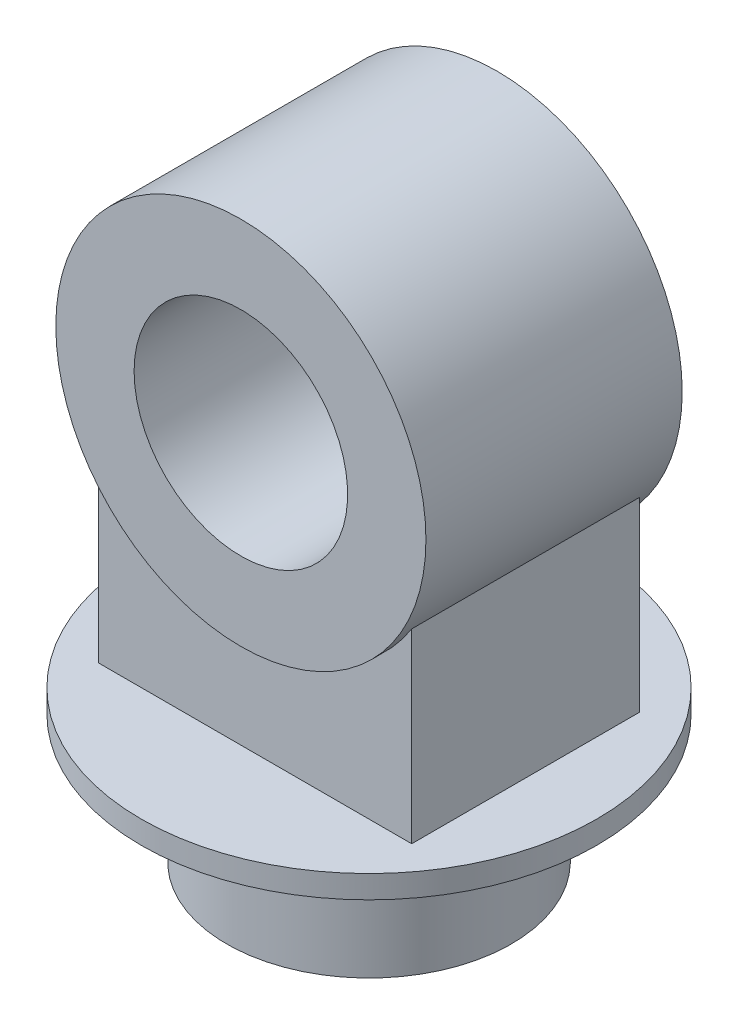
ISO-10303-21;
HEADER;
FILE_DESCRIPTION(('STEP AP214'),'2;1');
FILE_NAME('part.step','',(''),(''),'','','');
FILE_SCHEMA(('AUTOMOTIVE_DESIGN { 1 0 10303 214 1 1 1 1 }'));
ENDSEC;
DATA;
#1=APPLICATION_CONTEXT('core data for automotive mechanical design processes');
#2=APPLICATION_PROTOCOL_DEFINITION('international standard','automotive_design',2000,#1);
#3=PRODUCT_CONTEXT('',#1,'mechanical');
#4=PRODUCT('Part','Part','',(#3));
#5=PRODUCT_RELATED_PRODUCT_CATEGORY('part','',(#4));
#6=PRODUCT_DEFINITION_FORMATION('','',#4);
#7=PRODUCT_DEFINITION_CONTEXT('part definition',#1,'design');
#8=PRODUCT_DEFINITION('design','',#6,#7);
#9=PRODUCT_DEFINITION_SHAPE('','',#8);
#10=(LENGTH_UNIT() NAMED_UNIT(*) SI_UNIT(.MILLI.,.METRE.));
#11=(NAMED_UNIT(*) PLANE_ANGLE_UNIT() SI_UNIT($,.RADIAN.));
#12=(NAMED_UNIT(*) SI_UNIT($,.STERADIAN.) SOLID_ANGLE_UNIT());
#13=UNCERTAINTY_MEASURE_WITH_UNIT(LENGTH_MEASURE(1.E-05),#10,'distance_accuracy_value','');
#14=(GEOMETRIC_REPRESENTATION_CONTEXT(3) GLOBAL_UNCERTAINTY_ASSIGNED_CONTEXT((#13)) GLOBAL_UNIT_ASSIGNED_CONTEXT((#10,
#11,#12)) REPRESENTATION_CONTEXT('',''));
#15=CARTESIAN_POINT('',(0.,0.,0.));
#16=DIRECTION('',(0.,0.,1.));
#17=DIRECTION('',(1.,0.,0.));
#18=AXIS2_PLACEMENT_3D('',#15,#16,#17);
#19=CARTESIAN_POINT('',(0.,90.,0.));
#20=DIRECTION('',(0.,-1.,0.));
#21=DIRECTION('',(0.,0.,-1.));
#22=AXIS2_PLACEMENT_3D('',#19,#20,#21);
#23=CYLINDRICAL_SURFACE('',#22,100.);
#24=CARTESIAN_POINT('',(0.,90.,0.));
#25=DIRECTION('',(0.,1.,0.));
#26=DIRECTION('',(0.,0.,1.));
#27=AXIS2_PLACEMENT_3D('',#24,#25,#26);
#28=CIRCLE('',#27,100.);
#29=CARTESIAN_POINT('',(0.,90.,-100.));
#30=VERTEX_POINT('',#29);
#31=EDGE_CURVE('E11',#30,#30,#28,.T.);
#32=CARTESIAN_POINT('',(0.,0.,0.));
#33=DIRECTION('',(0.,1.,0.));
#34=DIRECTION('',(0.,0.,1.));
#35=AXIS2_PLACEMENT_3D('',#32,#33,#34);
#36=CIRCLE('',#35,100.);
#37=CARTESIAN_POINT('',(0.,0.,-100.));
#38=VERTEX_POINT('',#37);
#39=EDGE_CURVE('E45',#38,#38,#36,.T.);
#40=CARTESIAN_POINT('',(0.,90.,-100.));
#41=CARTESIAN_POINT('',(0.,89.0625,-100.));
#42=CARTESIAN_POINT('',(0.,88.125,-100.));
#43=CARTESIAN_POINT('',(0.,86.25,-100.));
#44=CARTESIAN_POINT('',(0.,85.3125,-100.));
#45=CARTESIAN_POINT('',(0.,83.4375,-100.));
#46=CARTESIAN_POINT('',(0.,82.5,-100.));
#47=CARTESIAN_POINT('',(0.,80.625,-100.));
#48=CARTESIAN_POINT('',(0.,79.6875,-100.));
#49=CARTESIAN_POINT('',(0.,77.8125,-100.));
#50=CARTESIAN_POINT('',(0.,76.875,-100.));
#51=CARTESIAN_POINT('',(0.,75.,-100.));
#52=CARTESIAN_POINT('',(0.,74.0625,-100.));
#53=CARTESIAN_POINT('',(0.,72.1875,-100.));
#54=CARTESIAN_POINT('',(0.,71.25,-100.));
#55=CARTESIAN_POINT('',(0.,69.375,-100.));
#56=CARTESIAN_POINT('',(0.,68.4375,-100.));
#57=CARTESIAN_POINT('',(0.,66.5625,-100.));
#58=CARTESIAN_POINT('',(0.,65.625,-100.));
#59=CARTESIAN_POINT('',(0.,63.75,-100.));
#60=CARTESIAN_POINT('',(0.,62.8125,-100.));
#61=CARTESIAN_POINT('',(0.,60.9375,-100.));
#62=CARTESIAN_POINT('',(0.,60.,-100.));
#63=CARTESIAN_POINT('',(0.,58.125,-100.));
#64=CARTESIAN_POINT('',(0.,57.1875,-100.));
#65=CARTESIAN_POINT('',(0.,55.3125,-100.));
#66=CARTESIAN_POINT('',(0.,54.375,-100.));
#67=CARTESIAN_POINT('',(0.,52.5,-100.));
#68=CARTESIAN_POINT('',(0.,51.5625,-100.));
#69=CARTESIAN_POINT('',(0.,49.6875,-100.));
#70=CARTESIAN_POINT('',(0.,48.75,-100.));
#71=CARTESIAN_POINT('',(0.,46.875,-100.));
#72=CARTESIAN_POINT('',(0.,45.9375,-100.));
#73=CARTESIAN_POINT('',(0.,44.0625,-100.));
#74=CARTESIAN_POINT('',(0.,43.125,-100.));
#75=CARTESIAN_POINT('',(0.,41.25,-100.));
#76=CARTESIAN_POINT('',(0.,40.3125,-100.));
#77=CARTESIAN_POINT('',(0.,38.4375,-100.));
#78=CARTESIAN_POINT('',(0.,37.5,-100.));
#79=CARTESIAN_POINT('',(0.,35.625,-100.));
#80=CARTESIAN_POINT('',(0.,34.6875,-100.));
#81=CARTESIAN_POINT('',(0.,32.8125,-100.));
#82=CARTESIAN_POINT('',(0.,31.875,-100.));
#83=CARTESIAN_POINT('',(0.,30.,-100.));
#84=CARTESIAN_POINT('',(0.,29.0625,-100.));
#85=CARTESIAN_POINT('',(0.,27.1875,-100.));
#86=CARTESIAN_POINT('',(0.,26.25,-100.));
#87=CARTESIAN_POINT('',(0.,24.375,-100.));
#88=CARTESIAN_POINT('',(0.,23.4375,-100.));
#89=CARTESIAN_POINT('',(0.,21.5625,-100.));
#90=CARTESIAN_POINT('',(0.,20.625,-100.));
#91=CARTESIAN_POINT('',(0.,18.75,-100.));
#92=CARTESIAN_POINT('',(0.,17.8125,-100.));
#93=CARTESIAN_POINT('',(0.,15.9375,-100.));
#94=CARTESIAN_POINT('',(0.,15.,-100.));
#95=CARTESIAN_POINT('',(0.,13.125,-100.));
#96=CARTESIAN_POINT('',(0.,12.1875,-100.));
#97=CARTESIAN_POINT('',(0.,10.3125,-100.));
#98=CARTESIAN_POINT('',(0.,9.37499999999999,-100.));
#99=CARTESIAN_POINT('',(0.,7.49999999999999,-100.));
#100=CARTESIAN_POINT('',(0.,6.56249999999999,-100.));
#101=CARTESIAN_POINT('',(0.,4.68749999999999,-100.));
#102=CARTESIAN_POINT('',(0.,3.74999999999998,-100.));
#103=CARTESIAN_POINT('',(0.,1.87499999999998,-100.));
#104=CARTESIAN_POINT('',(0.,0.937499999999986,-100.));
#105=CARTESIAN_POINT('',(0.,0.,-100.));
#106=B_SPLINE_CURVE_WITH_KNOTS('',3,(#40,#41,#42,#43,#44,#45,#46,#47,#48,#49,#50,#51,#52,#53,
#54,#55,#56,#57,#58,#59,#60,#61,#62,#63,#64,#65,#66,#67,#68,#69,#70,#71,#72,#73,#74,#75,#76,#77,
#78,#79,#80,#81,#82,#83,#84,#85,#86,#87,#88,#89,#90,#91,#92,#93,#94,#95,#96,#97,#98,#99,#100,
#101,#102,#103,#104,#105),.UNSPECIFIED.,.F.,.F.,(4,2,2,2,2,2,2,2,2,2,2,2,2,2,2,2,2,2,2,2,2,2,2,
2,2,2,2,2,2,2,2,2,4),(0.,2.81250000000001,5.62500000000001,8.43750000000001,11.25,14.0625,
16.875,19.6875,22.5,25.3125,28.125,30.9375,33.75,36.5625,39.375,42.1875,45.,47.8125,50.625,
53.4375,56.25,59.0625,61.875,64.6875,67.5,70.3125,73.125,75.9375,78.75,81.5625,84.375,87.1875,
90.),.UNSPECIFIED.);
#107=EDGE_CURVE('BSEAM42',#30,#38,#106,.T.);
#108=ORIENTED_EDGE('',*,*,#31,.F.);
#109=ORIENTED_EDGE('',*,*,#39,.T.);
#110=ORIENTED_EDGE('',*,*,#107,.T.);
#111=ORIENTED_EDGE('',*,*,#107,.F.);
#112=EDGE_LOOP('',(#108,#110,#109,#111));
#113=FACE_BOUND('',#112,.T.);
#114=ADVANCED_FACE('F42',(#113),#23,.T.);
#115=CARTESIAN_POINT('',(0.,0.,0.));
#116=DIRECTION('',(0.,1.,0.));
#117=DIRECTION('',(0.,0.,1.));
#118=AXIS2_PLACEMENT_3D('',#115,#116,#117);
#119=PLANE('',#118);
#120=ORIENTED_EDGE('',*,*,#39,.F.);
#121=EDGE_LOOP('',(#120));
#122=FACE_BOUND('',#121,.T.);
#123=ADVANCED_FACE('F160',(#122),#119,.F.);
#124=CARTESIAN_POINT('',(0.,106.,0.));
#125=DIRECTION('',(0.,-1.,0.));
#126=DIRECTION('',(0.,0.,-1.));
#127=AXIS2_PLACEMENT_3D('',#124,#125,#126);
#128=CYLINDRICAL_SURFACE('',#127,160.);
#129=CARTESIAN_POINT('',(0.,106.,0.));
#130=DIRECTION('',(0.,1.,0.));
#131=DIRECTION('',(0.,0.,1.));
#132=AXIS2_PLACEMENT_3D('',#129,#130,#131);
#133=CIRCLE('',#132,160.);
#134=CARTESIAN_POINT('',(0.,106.,160.));
#135=VERTEX_POINT('',#134);
#136=EDGE_CURVE('E116',#135,#135,#133,.T.);
#137=ORIENTED_EDGE('',*,*,#136,.F.);
#138=EDGE_LOOP('',(#137));
#139=FACE_BOUND('',#138,.T.);
#140=CARTESIAN_POINT('',(0.,90.,0.));
#141=DIRECTION('',(0.,1.,0.));
#142=DIRECTION('',(0.,0.,1.));
#143=AXIS2_PLACEMENT_3D('',#140,#141,#142);
#144=CIRCLE('',#143,160.);
#145=CARTESIAN_POINT('',(0.,90.,160.));
#146=VERTEX_POINT('',#145);
#147=EDGE_CURVE('E120',#146,#146,#144,.T.);
#148=ORIENTED_EDGE('',*,*,#147,.T.);
#149=EDGE_LOOP('',(#148));
#150=FACE_BOUND('',#149,.T.);
#151=ADVANCED_FACE('F155',(#139,#150),#128,.T.);
#152=CARTESIAN_POINT('',(0.,106.,0.));
#153=DIRECTION('',(0.,1.,0.));
#154=DIRECTION('',(0.,0.,1.));
#155=AXIS2_PLACEMENT_3D('',#152,#153,#154);
#156=PLANE('',#155);
#157=DIRECTION('',(0.,0.,-1.));
#158=VECTOR('',#157,1.);
#159=CARTESIAN_POINT('',(110.,106.,-80.));
#160=LINE('',#159,#158);
#161=CARTESIAN_POINT('',(110.,106.,80.));
#162=VERTEX_POINT('',#161);
#163=CARTESIAN_POINT('',(110.,106.,-80.));
#164=VERTEX_POINT('',#163);
#165=EDGE_CURVE('E57',#162,#164,#160,.T.);
#166=ORIENTED_EDGE('',*,*,#165,.F.);
#167=DIRECTION('',(1.,0.,0.));
#168=VECTOR('',#167,1.);
#169=CARTESIAN_POINT('',(-110.,106.,80.));
#170=LINE('',#169,#168);
#171=CARTESIAN_POINT('',(-110.,106.,80.));
#172=VERTEX_POINT('',#171);
#173=EDGE_CURVE('E62',#172,#162,#170,.T.);
#174=ORIENTED_EDGE('',*,*,#173,.F.);
#175=DIRECTION('',(0.,0.,1.));
#176=VECTOR('',#175,1.);
#177=CARTESIAN_POINT('',(-110.,106.,-80.));
#178=LINE('',#177,#176);
#179=CARTESIAN_POINT('',(-110.,106.,-80.));
#180=VERTEX_POINT('',#179);
#181=EDGE_CURVE('E128',#180,#172,#178,.T.);
#182=ORIENTED_EDGE('',*,*,#181,.F.);
#183=DIRECTION('',(-1.,0.,0.));
#184=VECTOR('',#183,1.);
#185=CARTESIAN_POINT('',(-110.,106.,-80.));
#186=LINE('',#185,#184);
#187=EDGE_CURVE('E88',#164,#180,#186,.T.);
#188=ORIENTED_EDGE('',*,*,#187,.F.);
#189=EDGE_LOOP('',(#166,#174,#182,#188));
#190=FACE_BOUND('',#189,.T.);
#191=ORIENTED_EDGE('',*,*,#136,.T.);
#192=EDGE_LOOP('',(#191));
#193=FACE_BOUND('',#192,.T.);
#194=ADVANCED_FACE('F151',(#190,#193),#156,.T.);
#195=CARTESIAN_POINT('',(0.,90.,0.));
#196=DIRECTION('',(0.,1.,0.));
#197=DIRECTION('',(0.,0.,1.));
#198=AXIS2_PLACEMENT_3D('',#195,#196,#197);
#199=PLANE('',#198);
#200=ORIENTED_EDGE('',*,*,#31,.T.);
#201=EDGE_LOOP('',(#200));
#202=FACE_BOUND('',#201,.T.);
#203=ORIENTED_EDGE('',*,*,#147,.F.);
#204=EDGE_LOOP('',(#203));
#205=FACE_BOUND('',#204,.T.);
#206=ADVANCED_FACE('F154',(#202,#205),#199,.F.);
#207=CARTESIAN_POINT('',(-110.,436.002,-80.));
#208=DIRECTION('',(0.,0.,1.));
#209=DIRECTION('',(1.,0.,0.));
#210=AXIS2_PLACEMENT_3D('',#207,#208,#209);
#211=PLANE('',#210);
#212=CARTESIAN_POINT('',(0.,306.,-80.));
#213=DIRECTION('',(0.,0.,1.));
#214=DIRECTION('',(1.,0.,0.));
#215=AXIS2_PLACEMENT_3D('',#212,#213,#214);
#216=CIRCLE('',#215,130.);
#217=CARTESIAN_POINT('',(110.,236.717967697245,-80.));
#218=VERTEX_POINT('',#217);
#219=CARTESIAN_POINT('',(-110.,236.717967697245,-80.));
#220=VERTEX_POINT('',#219);
#221=EDGE_CURVE('E100',#218,#220,#216,.F.);
#222=ORIENTED_EDGE('',*,*,#221,.F.);
#223=DIRECTION('',(0.,-1.,0.));
#224=VECTOR('',#223,1.);
#225=CARTESIAN_POINT('',(110.,436.002,-80.));
#226=LINE('',#225,#224);
#227=EDGE_CURVE('E96',#218,#164,#226,.T.);
#228=ORIENTED_EDGE('',*,*,#227,.T.);
#229=ORIENTED_EDGE('',*,*,#187,.T.);
#230=DIRECTION('',(0.,-1.,0.));
#231=VECTOR('',#230,1.);
#232=CARTESIAN_POINT('',(-110.,436.002,-80.));
#233=LINE('',#232,#231);
#234=EDGE_CURVE('E140',#220,#180,#233,.T.);
#235=ORIENTED_EDGE('',*,*,#234,.F.);
#236=EDGE_LOOP('',(#222,#228,#229,#235));
#237=FACE_BOUND('',#236,.T.);
#238=ADVANCED_FACE('F148',(#237),#211,.F.);
#239=CARTESIAN_POINT('',(110.,436.002,-80.));
#240=DIRECTION('',(-1.,0.,0.));
#241=DIRECTION('',(0.,0.,1.));
#242=AXIS2_PLACEMENT_3D('',#239,#240,#241);
#243=PLANE('',#242);
#244=DIRECTION('',(0.,0.,-1.));
#245=VECTOR('',#244,1.);
#246=CARTESIAN_POINT('',(110.,236.717967697245,90.));
#247=LINE('',#246,#245);
#248=CARTESIAN_POINT('',(110.,236.717967697245,80.));
#249=VERTEX_POINT('',#248);
#250=EDGE_CURVE('E93',#249,#218,#247,.T.);
#251=ORIENTED_EDGE('',*,*,#250,.F.);
#252=DIRECTION('',(0.,-1.,0.));
#253=VECTOR('',#252,1.);
#254=CARTESIAN_POINT('',(110.,436.002,80.));
#255=LINE('',#254,#253);
#256=EDGE_CURVE('E80',#249,#162,#255,.T.);
#257=ORIENTED_EDGE('',*,*,#256,.T.);
#258=ORIENTED_EDGE('',*,*,#165,.T.);
#259=ORIENTED_EDGE('',*,*,#227,.F.);
#260=EDGE_LOOP('',(#251,#257,#258,#259));
#261=FACE_BOUND('',#260,.T.);
#262=ADVANCED_FACE('F94',(#261),#243,.F.);
#263=CARTESIAN_POINT('',(-110.,436.002,-80.));
#264=DIRECTION('',(1.,0.,0.));
#265=DIRECTION('',(0.,0.,-1.));
#266=AXIS2_PLACEMENT_3D('',#263,#264,#265);
#267=PLANE('',#266);
#268=DIRECTION('',(0.,0.,-1.));
#269=VECTOR('',#268,1.);
#270=CARTESIAN_POINT('',(-110.,236.717967697245,90.));
#271=LINE('',#270,#269);
#272=CARTESIAN_POINT('',(-110.,236.717967697245,80.));
#273=VERTEX_POINT('',#272);
#274=EDGE_CURVE('E104',#220,#273,#271,.F.);
#275=ORIENTED_EDGE('',*,*,#274,.F.);
#276=ORIENTED_EDGE('',*,*,#234,.T.);
#277=ORIENTED_EDGE('',*,*,#181,.T.);
#278=DIRECTION('',(0.,-1.,0.));
#279=VECTOR('',#278,1.);
#280=CARTESIAN_POINT('',(-110.,436.002,80.));
#281=LINE('',#280,#279);
#282=EDGE_CURVE('E89',#273,#172,#281,.T.);
#283=ORIENTED_EDGE('',*,*,#282,.F.);
#284=EDGE_LOOP('',(#275,#276,#277,#283));
#285=FACE_BOUND('',#284,.T.);
#286=ADVANCED_FACE('F150',(#285),#267,.F.);
#287=CARTESIAN_POINT('',(-110.,436.002,80.));
#288=DIRECTION('',(0.,0.,-1.));
#289=DIRECTION('',(-1.,0.,0.));
#290=AXIS2_PLACEMENT_3D('',#287,#288,#289);
#291=PLANE('',#290);
#292=CARTESIAN_POINT('',(0.,306.,80.));
#293=DIRECTION('',(0.,0.,-1.));
#294=DIRECTION('',(-1.,0.,0.));
#295=AXIS2_PLACEMENT_3D('',#292,#293,#294);
#296=CIRCLE('',#295,130.);
#297=EDGE_CURVE('E84',#273,#249,#296,.F.);
#298=ORIENTED_EDGE('',*,*,#297,.F.);
#299=ORIENTED_EDGE('',*,*,#282,.T.);
#300=ORIENTED_EDGE('',*,*,#173,.T.);
#301=ORIENTED_EDGE('',*,*,#256,.F.);
#302=EDGE_LOOP('',(#298,#299,#300,#301));
#303=FACE_BOUND('',#302,.T.);
#304=ADVANCED_FACE('F82',(#303),#291,.F.);
#305=CARTESIAN_POINT('',(0.,306.,90.));
#306=DIRECTION('',(0.,0.,-1.));
#307=DIRECTION('',(-1.,0.,0.));
#308=AXIS2_PLACEMENT_3D('',#305,#306,#307);
#309=CYLINDRICAL_SURFACE('',#308,130.);
#310=CARTESIAN_POINT('',(0.,306.,90.));
#311=DIRECTION('',(0.,0.,1.));
#312=DIRECTION('',(1.,0.,0.));
#313=AXIS2_PLACEMENT_3D('',#310,#311,#312);
#314=CIRCLE('',#313,130.);
#315=CARTESIAN_POINT('',(130.,306.,90.));
#316=VERTEX_POINT('',#315);
#317=EDGE_CURVE('E106',#316,#316,#314,.T.);
#318=ORIENTED_EDGE('',*,*,#317,.F.);
#319=EDGE_LOOP('',(#318));
#320=FACE_BOUND('',#319,.T.);
#321=CARTESIAN_POINT('',(0.,306.,-90.));
#322=DIRECTION('',(0.,0.,1.));
#323=DIRECTION('',(1.,0.,0.));
#324=AXIS2_PLACEMENT_3D('',#321,#322,#323);
#325=CIRCLE('',#324,130.);
#326=CARTESIAN_POINT('',(130.,306.,-90.));
#327=VERTEX_POINT('',#326);
#328=EDGE_CURVE('E112',#327,#327,#325,.T.);
#329=ORIENTED_EDGE('',*,*,#328,.T.);
#330=EDGE_LOOP('',(#329));
#331=FACE_BOUND('',#330,.T.);
#332=ORIENTED_EDGE('',*,*,#250,.T.);
#333=ORIENTED_EDGE('',*,*,#221,.T.);
#334=ORIENTED_EDGE('',*,*,#274,.T.);
#335=ORIENTED_EDGE('',*,*,#297,.T.);
#336=EDGE_LOOP('',(#332,#333,#334,#335));
#337=FACE_BOUND('',#336,.T.);
#338=ADVANCED_FACE('F103',(#320,#331,#337),#309,.T.);
#339=CARTESIAN_POINT('',(0.,306.,90.));
#340=DIRECTION('',(0.,0.,1.));
#341=DIRECTION('',(1.,0.,0.));
#342=AXIS2_PLACEMENT_3D('',#339,#340,#341);
#343=PLANE('',#342);
#344=ORIENTED_EDGE('',*,*,#317,.T.);
#345=EDGE_LOOP('',(#344));
#346=FACE_BOUND('',#345,.T.);
#347=CARTESIAN_POINT('',(0.,306.,90.));
#348=DIRECTION('',(0.,0.,1.));
#349=DIRECTION('',(1.,0.,0.));
#350=AXIS2_PLACEMENT_3D('',#347,#348,#349);
#351=CIRCLE('',#350,75.);
#352=CARTESIAN_POINT('',(-75.,306.,90.));
#353=VERTEX_POINT('',#352);
#354=EDGE_CURVE('E209',#353,#353,#351,.T.);
#355=ORIENTED_EDGE('',*,*,#354,.F.);
#356=EDGE_LOOP('',(#355));
#357=FACE_BOUND('',#356,.T.);
#358=ADVANCED_FACE('F192',(#346,#357),#343,.T.);
#359=CARTESIAN_POINT('',(0.,306.,-90.));
#360=DIRECTION('',(0.,0.,1.));
#361=DIRECTION('',(1.,0.,0.));
#362=AXIS2_PLACEMENT_3D('',#359,#360,#361);
#363=PLANE('',#362);
#364=ORIENTED_EDGE('',*,*,#328,.F.);
#365=EDGE_LOOP('',(#364));
#366=FACE_BOUND('',#365,.T.);
#367=CARTESIAN_POINT('',(0.,306.,-90.));
#368=DIRECTION('',(0.,0.,1.));
#369=DIRECTION('',(1.,0.,0.));
#370=AXIS2_PLACEMENT_3D('',#367,#368,#369);
#371=CIRCLE('',#370,75.);
#372=CARTESIAN_POINT('',(-75.,306.,-90.));
#373=VERTEX_POINT('',#372);
#374=EDGE_CURVE('E212',#373,#373,#371,.T.);
#375=ORIENTED_EDGE('',*,*,#374,.T.);
#376=EDGE_LOOP('',(#375));
#377=FACE_BOUND('',#376,.T.);
#378=ADVANCED_FACE('F194',(#366,#377),#363,.F.);
#379=CARTESIAN_POINT('',(0.,306.,90.));
#380=DIRECTION('',(0.,0.,-1.));
#381=DIRECTION('',(-1.,0.,0.));
#382=AXIS2_PLACEMENT_3D('',#379,#380,#381);
#383=CYLINDRICAL_SURFACE('',#382,75.);
#384=CARTESIAN_POINT('',(-75.,306.,90.));
#385=CARTESIAN_POINT('',(-75.,306.,88.125));
#386=CARTESIAN_POINT('',(-75.,306.,86.25));
#387=CARTESIAN_POINT('',(-75.,306.,82.5));
#388=CARTESIAN_POINT('',(-75.,306.,80.625));
#389=CARTESIAN_POINT('',(-75.,306.,76.875));
#390=CARTESIAN_POINT('',(-75.,306.,75.));
#391=CARTESIAN_POINT('',(-75.,306.,71.25));
#392=CARTESIAN_POINT('',(-75.,306.,69.375));
#393=CARTESIAN_POINT('',(-75.,306.,65.625));
#394=CARTESIAN_POINT('',(-75.,306.,63.75));
#395=CARTESIAN_POINT('',(-75.,306.,60.));
#396=CARTESIAN_POINT('',(-75.,306.,58.125));
#397=CARTESIAN_POINT('',(-75.,306.,54.375));
#398=CARTESIAN_POINT('',(-75.,306.,52.5));
#399=CARTESIAN_POINT('',(-75.,306.,48.75));
#400=CARTESIAN_POINT('',(-75.,306.,46.875));
#401=CARTESIAN_POINT('',(-75.,306.,43.125));
#402=CARTESIAN_POINT('',(-75.,306.,41.25));
#403=CARTESIAN_POINT('',(-75.,306.,37.5));
#404=CARTESIAN_POINT('',(-75.,306.,35.625));
#405=CARTESIAN_POINT('',(-75.,306.,31.875));
#406=CARTESIAN_POINT('',(-75.,306.,30.));
#407=CARTESIAN_POINT('',(-75.,306.,26.25));
#408=CARTESIAN_POINT('',(-75.,306.,24.375));
#409=CARTESIAN_POINT('',(-75.,306.,20.625));
#410=CARTESIAN_POINT('',(-75.,306.,18.75));
#411=CARTESIAN_POINT('',(-75.,306.,15.));
#412=CARTESIAN_POINT('',(-75.,306.,13.125));
#413=CARTESIAN_POINT('',(-75.,306.,9.37499999999998));
#414=CARTESIAN_POINT('',(-75.,306.,7.49999999999998));
#415=CARTESIAN_POINT('',(-75.,306.,3.74999999999998));
#416=CARTESIAN_POINT('',(-75.,306.,1.87499999999997));
#417=CARTESIAN_POINT('',(-75.,306.,-1.87500000000003));
#418=CARTESIAN_POINT('',(-75.,306.,-3.75000000000003));
#419=CARTESIAN_POINT('',(-75.,306.,-7.50000000000003));
#420=CARTESIAN_POINT('',(-75.,306.,-9.37500000000004));
#421=CARTESIAN_POINT('',(-75.,306.,-13.125));
#422=CARTESIAN_POINT('',(-75.,306.,-15.));
#423=CARTESIAN_POINT('',(-75.,306.,-18.75));
#424=CARTESIAN_POINT('',(-75.,306.,-20.625));
#425=CARTESIAN_POINT('',(-75.,306.,-24.375));
#426=CARTESIAN_POINT('',(-75.,306.,-26.25));
#427=CARTESIAN_POINT('',(-75.,306.,-30.));
#428=CARTESIAN_POINT('',(-75.,306.,-31.875));
#429=CARTESIAN_POINT('',(-75.,306.,-35.625));
#430=CARTESIAN_POINT('',(-75.,306.,-37.5));
#431=CARTESIAN_POINT('',(-75.,306.,-41.25));
#432=CARTESIAN_POINT('',(-75.,306.,-43.125));
#433=CARTESIAN_POINT('',(-75.,306.,-46.875));
#434=CARTESIAN_POINT('',(-75.,306.,-48.75));
#435=CARTESIAN_POINT('',(-75.,306.,-52.5));
#436=CARTESIAN_POINT('',(-75.,306.,-54.375));
#437=CARTESIAN_POINT('',(-75.,306.,-58.125));
#438=CARTESIAN_POINT('',(-75.,306.,-60.));
#439=CARTESIAN_POINT('',(-75.,306.,-63.75));
#440=CARTESIAN_POINT('',(-75.,306.,-65.625));
#441=CARTESIAN_POINT('',(-75.,306.,-69.375));
#442=CARTESIAN_POINT('',(-75.,306.,-71.25));
#443=CARTESIAN_POINT('',(-75.,306.,-75.));
#444=CARTESIAN_POINT('',(-75.,306.,-76.875));
#445=CARTESIAN_POINT('',(-75.,306.,-80.625));
#446=CARTESIAN_POINT('',(-75.,306.,-82.5));
#447=CARTESIAN_POINT('',(-75.,306.,-86.25));
#448=CARTESIAN_POINT('',(-75.,306.,-88.125));
#449=CARTESIAN_POINT('',(-75.,306.,-90.));
#450=B_SPLINE_CURVE_WITH_KNOTS('',3,(#384,#385,#386,#387,#388,#389,#390,#391,#392,#393,#394,
#395,#396,#397,#398,#399,#400,#401,#402,#403,#404,#405,#406,#407,#408,#409,#410,#411,#412,#413,
#414,#415,#416,#417,#418,#419,#420,#421,#422,#423,#424,#425,#426,#427,#428,#429,#430,#431,#432,
#433,#434,#435,#436,#437,#438,#439,#440,#441,#442,#443,#444,#445,#446,#447,#448,#449),
.UNSPECIFIED.,.F.,.F.,(4,2,2,2,2,2,2,2,2,2,2,2,2,2,2,2,2,2,2,2,2,2,2,2,2,2,2,2,2,2,2,2,4),(0.,
5.62499999999999,11.25,16.875,22.5,28.125,33.75,39.375,45.,50.625,56.25,61.875,67.5,73.125,
78.75,84.375,90.,95.625,101.25,106.875,112.5,118.125,123.75,129.375,135.,140.625,146.25,151.875,
157.5,163.125,168.75,174.375,180.),.UNSPECIFIED.);
#451=EDGE_CURVE('BSEAM197',#353,#373,#450,.T.);
#452=ORIENTED_EDGE('',*,*,#354,.T.);
#453=ORIENTED_EDGE('',*,*,#374,.F.);
#454=ORIENTED_EDGE('',*,*,#451,.T.);
#455=ORIENTED_EDGE('',*,*,#451,.F.);
#456=EDGE_LOOP('',(#452,#454,#453,#455));
#457=FACE_BOUND('',#456,.T.);
#458=ADVANCED_FACE('F197',(#457),#383,.F.);
#459=CLOSED_SHELL('',(#114,#123,#151,#194,#206,#238,#262,#286,#304,#338,#358,#378,#458));
#460=MANIFOLD_SOLID_BREP('B2',#459);
#461=ADVANCED_BREP_SHAPE_REPRESENTATION('',(#18,#460),#14);
#462=SHAPE_DEFINITION_REPRESENTATION(#9,#461);
ENDSEC;
END-ISO-10303-21;
